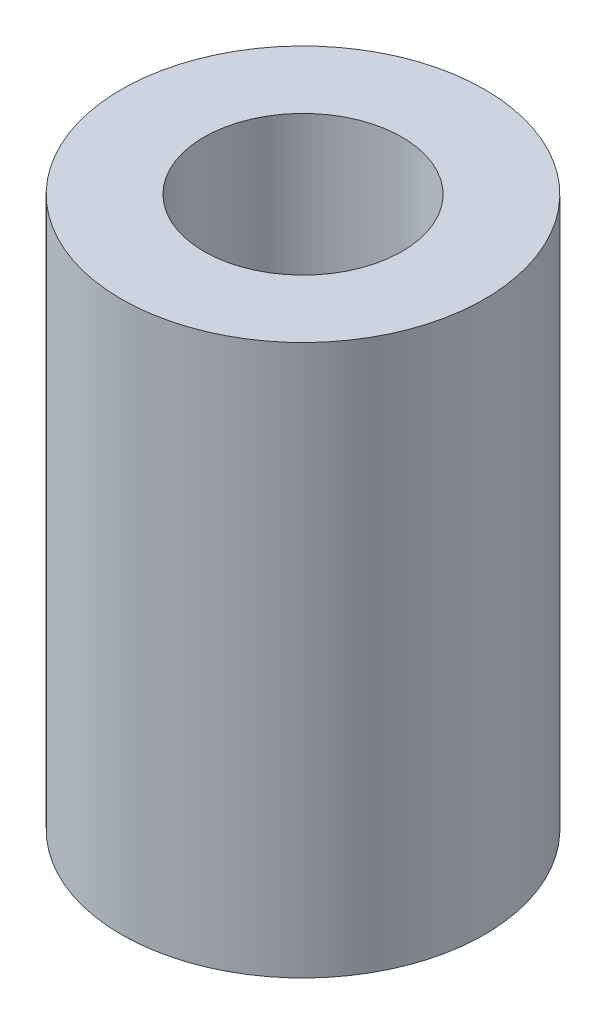
ISO-10303-21;
HEADER;
FILE_DESCRIPTION(('STEP AP214'),'2;1');
FILE_NAME('part.step','',(''),(''),'','','');
FILE_SCHEMA(('AUTOMOTIVE_DESIGN { 1 0 10303 214 1 1 1 1 }'));
ENDSEC;
DATA;
#1=APPLICATION_CONTEXT('core data for automotive mechanical design processes');
#2=APPLICATION_PROTOCOL_DEFINITION('international standard','automotive_design',2000,#1);
#3=PRODUCT_CONTEXT('',#1,'mechanical');
#4=PRODUCT('Part','Part','',(#3));
#5=PRODUCT_RELATED_PRODUCT_CATEGORY('part','',(#4));
#6=PRODUCT_DEFINITION_FORMATION('','',#4);
#7=PRODUCT_DEFINITION_CONTEXT('part definition',#1,'design');
#8=PRODUCT_DEFINITION('design','',#6,#7);
#9=PRODUCT_DEFINITION_SHAPE('','',#8);
#10=(LENGTH_UNIT() NAMED_UNIT(*) SI_UNIT(.MILLI.,.METRE.));
#11=(NAMED_UNIT(*) PLANE_ANGLE_UNIT() SI_UNIT($,.RADIAN.));
#12=(NAMED_UNIT(*) SI_UNIT($,.STERADIAN.) SOLID_ANGLE_UNIT());
#13=UNCERTAINTY_MEASURE_WITH_UNIT(LENGTH_MEASURE(1.E-05),#10,'distance_accuracy_value','');
#14=(GEOMETRIC_REPRESENTATION_CONTEXT(3) GLOBAL_UNCERTAINTY_ASSIGNED_CONTEXT((#13)) GLOBAL_UNIT_ASSIGNED_CONTEXT((#10,
#11,#12)) REPRESENTATION_CONTEXT('',''));
#15=CARTESIAN_POINT('',(0.,0.,0.));
#16=DIRECTION('',(0.,0.,1.));
#17=DIRECTION('',(1.,0.,0.));
#18=AXIS2_PLACEMENT_3D('',#15,#16,#17);
#19=CARTESIAN_POINT('',(0.,25.4,0.));
#20=DIRECTION('',(0.,1.,0.));
#21=DIRECTION('',(0.,0.,1.));
#22=AXIS2_PLACEMENT_3D('',#19,#20,#21);
#23=PLANE('',#22);
#24=CARTESIAN_POINT('',(0.,25.4,0.));
#25=DIRECTION('',(0.,1.,0.));
#26=DIRECTION('',(0.,0.,1.));
#27=AXIS2_PLACEMENT_3D('',#24,#25,#26);
#28=CIRCLE('',#27,8.382);
#29=CARTESIAN_POINT('',(0.,25.4,8.382));
#30=VERTEX_POINT('',#29);
#31=EDGE_CURVE('E10',#30,#30,#28,.T.);
#32=ORIENTED_EDGE('',*,*,#31,.T.);
#33=EDGE_LOOP('',(#32));
#34=FACE_BOUND('',#33,.T.);
#35=CARTESIAN_POINT('',(0.,25.4,0.));
#36=DIRECTION('',(0.,1.,0.));
#37=DIRECTION('',(0.,0.,1.));
#38=AXIS2_PLACEMENT_3D('',#35,#36,#37);
#39=CIRCLE('',#38,4.572);
#40=CARTESIAN_POINT('',(0.,25.4,4.572));
#41=VERTEX_POINT('',#40);
#42=EDGE_CURVE('E48',#41,#41,#39,.T.);
#43=ORIENTED_EDGE('',*,*,#42,.F.);
#44=EDGE_LOOP('',(#43));
#45=FACE_BOUND('',#44,.T.);
#46=ADVANCED_FACE('F37',(#34,#45),#23,.T.);
#47=CARTESIAN_POINT('',(0.,0.,0.));
#48=DIRECTION('',(0.,1.,0.));
#49=DIRECTION('',(0.,0.,1.));
#50=AXIS2_PLACEMENT_3D('',#47,#48,#49);
#51=PLANE('',#50);
#52=CARTESIAN_POINT('',(0.,0.,0.));
#53=DIRECTION('',(0.,1.,0.));
#54=DIRECTION('',(0.,0.,1.));
#55=AXIS2_PLACEMENT_3D('',#52,#53,#54);
#56=CIRCLE('',#55,8.382);
#57=CARTESIAN_POINT('',(0.,0.,8.382));
#58=VERTEX_POINT('',#57);
#59=EDGE_CURVE('E41',#58,#58,#56,.T.);
#60=ORIENTED_EDGE('',*,*,#59,.F.);
#61=EDGE_LOOP('',(#60));
#62=FACE_BOUND('',#61,.T.);
#63=CARTESIAN_POINT('',(0.,0.,0.));
#64=DIRECTION('',(0.,1.,0.));
#65=DIRECTION('',(0.,0.,1.));
#66=AXIS2_PLACEMENT_3D('',#63,#64,#65);
#67=CIRCLE('',#66,4.572);
#68=CARTESIAN_POINT('',(0.,0.,4.572));
#69=VERTEX_POINT('',#68);
#70=EDGE_CURVE('E50',#69,#69,#67,.T.);
#71=ORIENTED_EDGE('',*,*,#70,.T.);
#72=EDGE_LOOP('',(#71));
#73=FACE_BOUND('',#72,.T.);
#74=ADVANCED_FACE('F60',(#62,#73),#51,.F.);
#75=CARTESIAN_POINT('',(0.,25.4,0.));
#76=DIRECTION('',(0.,-1.,0.));
#77=DIRECTION('',(0.,0.,-1.));
#78=AXIS2_PLACEMENT_3D('',#75,#76,#77);
#79=CYLINDRICAL_SURFACE('',#78,8.382);
#80=ORIENTED_EDGE('',*,*,#31,.F.);
#81=EDGE_LOOP('',(#80));
#82=FACE_BOUND('',#81,.T.);
#83=ORIENTED_EDGE('',*,*,#59,.T.);
#84=EDGE_LOOP('',(#83));
#85=FACE_BOUND('',#84,.T.);
#86=ADVANCED_FACE('F39',(#82,#85),#79,.T.);
#87=CARTESIAN_POINT('',(0.,25.4,0.));
#88=DIRECTION('',(0.,-1.,0.));
#89=DIRECTION('',(0.,0.,-1.));
#90=AXIS2_PLACEMENT_3D('',#87,#88,#89);
#91=CYLINDRICAL_SURFACE('',#90,4.572);
#92=ORIENTED_EDGE('',*,*,#42,.T.);
#93=EDGE_LOOP('',(#92));
#94=FACE_BOUND('',#93,.T.);
#95=ORIENTED_EDGE('',*,*,#70,.F.);
#96=EDGE_LOOP('',(#95));
#97=FACE_BOUND('',#96,.T.);
#98=ADVANCED_FACE('F56',(#94,#97),#91,.F.);
#99=CLOSED_SHELL('',(#46,#74,#86,#98));
#100=MANIFOLD_SOLID_BREP('B2',#99);
#101=ADVANCED_BREP_SHAPE_REPRESENTATION('',(#18,#100),#14);
#102=SHAPE_DEFINITION_REPRESENTATION(#9,#101);
ENDSEC;
END-ISO-10303-21;
